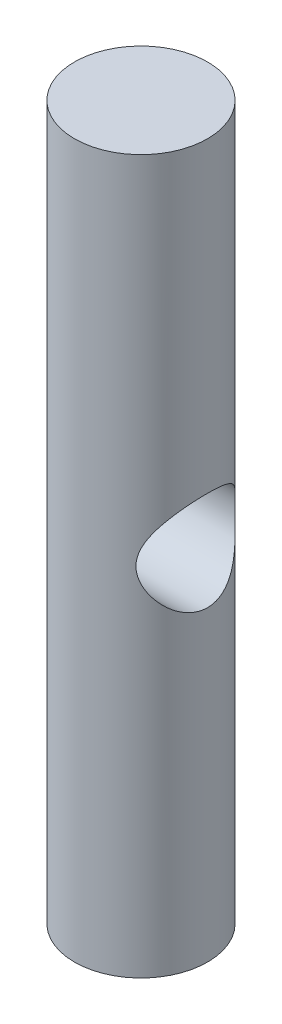
ISO-10303-21;
HEADER;
FILE_DESCRIPTION(('STEP AP214'),'2;1');
FILE_NAME('part.step','',(''),(''),'','','');
FILE_SCHEMA(('AUTOMOTIVE_DESIGN { 1 0 10303 214 1 1 1 1 }'));
ENDSEC;
DATA;
#1=APPLICATION_CONTEXT('core data for automotive mechanical design processes');
#2=APPLICATION_PROTOCOL_DEFINITION('international standard','automotive_design',2000,#1);
#3=PRODUCT_CONTEXT('',#1,'mechanical');
#4=PRODUCT('Part','Part','',(#3));
#5=PRODUCT_RELATED_PRODUCT_CATEGORY('part','',(#4));
#6=PRODUCT_DEFINITION_FORMATION('','',#4);
#7=PRODUCT_DEFINITION_CONTEXT('part definition',#1,'design');
#8=PRODUCT_DEFINITION('design','',#6,#7);
#9=PRODUCT_DEFINITION_SHAPE('','',#8);
#10=(LENGTH_UNIT() NAMED_UNIT(*) SI_UNIT(.MILLI.,.METRE.));
#11=(NAMED_UNIT(*) PLANE_ANGLE_UNIT() SI_UNIT($,.RADIAN.));
#12=(NAMED_UNIT(*) SI_UNIT($,.STERADIAN.) SOLID_ANGLE_UNIT());
#13=UNCERTAINTY_MEASURE_WITH_UNIT(LENGTH_MEASURE(1.E-05),#10,'distance_accuracy_value','');
#14=(GEOMETRIC_REPRESENTATION_CONTEXT(3) GLOBAL_UNCERTAINTY_ASSIGNED_CONTEXT((#13)) GLOBAL_UNIT_ASSIGNED_CONTEXT((#10,
#11,#12)) REPRESENTATION_CONTEXT('',''));
#15=CARTESIAN_POINT('',(0.,0.,0.));
#16=DIRECTION('',(0.,0.,1.));
#17=DIRECTION('',(1.,0.,0.));
#18=AXIS2_PLACEMENT_3D('',#15,#16,#17);
#19=CARTESIAN_POINT('',(0.,114.3,0.));
#20=DIRECTION('',(0.,-1.,0.));
#21=DIRECTION('',(0.,0.,-1.));
#22=AXIS2_PLACEMENT_3D('',#19,#20,#21);
#23=CYLINDRICAL_SURFACE('',#22,10.668);
#24=CARTESIAN_POINT('',(0.,114.3,0.));
#25=DIRECTION('',(0.,1.,0.));
#26=DIRECTION('',(0.,0.,1.));
#27=AXIS2_PLACEMENT_3D('',#24,#25,#26);
#28=CIRCLE('',#27,10.668);
#29=CARTESIAN_POINT('',(0.,114.3,10.668));
#30=VERTEX_POINT('',#29);
#31=EDGE_CURVE('E44',#30,#30,#28,.T.);
#32=ORIENTED_EDGE('',*,*,#31,.F.);
#33=EDGE_LOOP('',(#32));
#34=FACE_BOUND('',#33,.T.);
#35=CARTESIAN_POINT('',(0.,0.,0.));
#36=DIRECTION('',(0.,1.,0.));
#37=DIRECTION('',(0.,0.,1.));
#38=AXIS2_PLACEMENT_3D('',#35,#36,#37);
#39=CIRCLE('',#38,10.668);
#40=CARTESIAN_POINT('',(0.,0.,10.668));
#41=VERTEX_POINT('',#40);
#42=EDGE_CURVE('E48',#41,#41,#39,.T.);
#43=ORIENTED_EDGE('',*,*,#42,.T.);
#44=EDGE_LOOP('',(#43));
#45=FACE_BOUND('',#44,.T.);
#46=CARTESIAN_POINT('',(-7.12757446471098,57.15,7.9375));
#47=CARTESIAN_POINT('',(-7.1275782582537,57.3359229778828,7.93749812667577));
#48=CARTESIAN_POINT('',(-7.13488986877126,57.5218711362104,7.93094964996542));
#49=CARTESIAN_POINT('',(-7.16369207763003,57.8917601746274,7.90494155688109));
#50=CARTESIAN_POINT('',(-7.18518589704412,58.0757005890669,7.88547900744854));
#51=CARTESIAN_POINT('',(-7.24116104114432,58.4401999528348,7.83410781843201));
#52=CARTESIAN_POINT('',(-7.27566986599805,58.6207508863387,7.80217281996456));
#53=CARTESIAN_POINT('',(-7.35592943855328,58.9768887573134,7.72654888571563));
#54=CARTESIAN_POINT('',(-7.40168680699676,59.1524727031674,7.68285302620677));
#55=CARTESIAN_POINT('',(-7.50176542882527,59.4953569026921,7.5851530269348));
#56=CARTESIAN_POINT('',(-7.55595825834014,59.6627385630799,7.53130125329707));
#57=CARTESIAN_POINT('',(-7.6714886611951,59.9913130508089,7.41358938914481));
#58=CARTESIAN_POINT('',(-7.73282547014431,60.1525065378222,7.34973036913263));
#59=CARTESIAN_POINT('',(-7.92494223652926,60.6264946614711,7.14398604234518));
#60=CARTESIAN_POINT('',(-8.06390828927737,60.9299529311208,6.98785903000738));
#61=CARTESIAN_POINT('',(-8.29464257967159,61.3952016750473,6.70997107408412));
#62=CARTESIAN_POINT('',(-8.38323542779287,61.5653898068718,6.59918889448773));
#63=CARTESIAN_POINT('',(-8.56212621773988,61.8962699935625,6.36536334224975));
#64=CARTESIAN_POINT('',(-8.65242429737494,62.0569612765638,6.24231897516516));
#65=CARTESIAN_POINT('',(-8.83298177780522,62.368756210067,5.98410611473624));
#66=CARTESIAN_POINT('',(-8.92324094119569,62.5198459083775,5.84892063713774));
#67=CARTESIAN_POINT('',(-9.10191861623573,62.8117952238675,5.56679304751283));
#68=CARTESIAN_POINT('',(-9.19033712268011,62.9526548121202,5.41985090224539));
#69=CARTESIAN_POINT('',(-9.38108343652115,63.2506567629418,5.08388466129722));
#70=CARTESIAN_POINT('',(-9.48266148606145,63.4054308611042,4.89231788060584));
#71=CARTESIAN_POINT('',(-9.67825149608903,63.6981356460406,4.49300628499863));
#72=CARTESIAN_POINT('',(-9.77226179308477,63.8360626330263,4.28525793279973));
#73=CARTESIAN_POINT('',(-9.94991032769562,64.093126712137,3.85481719167538));
#74=CARTESIAN_POINT('',(-10.0335676991382,64.2122985809096,3.63215357942448));
#75=CARTESIAN_POINT('',(-10.1881170624292,64.4301999320132,3.17287114378755));
#76=CARTESIAN_POINT('',(-10.2590156503425,64.5289399812122,2.93625961571114));
#77=CARTESIAN_POINT('',(-10.3667817722848,64.6779236483152,2.52331126259019));
#78=CARTESIAN_POINT('',(-10.4074964766713,64.733853201444,2.35000501762191));
#79=CARTESIAN_POINT('',(-10.4806971445979,64.8340006673105,1.99835826673937));
#80=CARTESIAN_POINT('',(-10.5131850512656,64.8782213457375,1.82001896068982));
#81=CARTESIAN_POINT('',(-10.5692677409737,64.9543426643857,1.45947494688419));
#82=CARTESIAN_POINT('',(-10.5928684097485,64.9862514587217,1.27727288207752));
#83=CARTESIAN_POINT('',(-10.6307088783953,65.0373283469661,0.910114393632699));
#84=CARTESIAN_POINT('',(-10.6449483447914,65.0564959869942,0.72515787211198));
#85=CARTESIAN_POINT('',(-10.6637735725797,65.0818233289524,0.353390440480364));
#86=CARTESIAN_POINT('',(-10.6683347573192,65.0879499150611,0.166576016841276));
#87=CARTESIAN_POINT('',(-10.6676269488478,65.0869986179901,-0.206999685368297));
#88=CARTESIAN_POINT('',(-10.66235799421,65.0799207866243,-0.393760964144444));
#89=CARTESIAN_POINT('',(-10.6421074651865,65.0526714681407,-0.765828403781017));
#90=CARTESIAN_POINT('',(-10.6271239200418,65.0324973242269,-0.951134261664382));
#91=CARTESIAN_POINT('',(-10.5877742877013,64.9793655495664,-1.31888556977497));
#92=CARTESIAN_POINT('',(-10.5634082537452,64.9464079913576,-1.50133103622698));
#93=CARTESIAN_POINT('',(-10.5067678168636,64.8694886794467,-1.85614012265513));
#94=CARTESIAN_POINT('',(-10.4747824097391,64.8259280115467,-2.0286374503548));
#95=CARTESIAN_POINT('',(-10.4031139715916,64.7278350097179,-2.36890034919164));
#96=CARTESIAN_POINT('',(-10.3634282584372,64.6732988526155,-2.53666424821572));
#97=CARTESIAN_POINT('',(-10.2770673151524,64.5538839534095,-2.86656057430781));
#98=CARTESIAN_POINT('',(-10.2303938753026,64.4890078601605,-3.0286944307433));
#99=CARTESIAN_POINT('',(-10.1308037952371,64.3495305660412,-3.34676833303144));
#100=CARTESIAN_POINT('',(-10.0778848894646,64.2749258350492,-3.50270610365181));
#101=CARTESIAN_POINT('',(-9.89885357053805,64.020273909889,-3.99353316138266));
#102=CARTESIAN_POINT('',(-9.76198872776336,63.8223261763539,-4.31544189118964));
#103=CARTESIAN_POINT('',(-9.47022904502293,63.3877059551807,-4.92288566128622));
#104=CARTESIAN_POINT('',(-9.31531831999176,63.1509992741252,-5.20838818455684));
#105=CARTESIAN_POINT('',(-9.06084671753789,62.7455774735581,-5.63398123218334));
#106=CARTESIAN_POINT('',(-8.96408121440284,62.5878033860767,-5.78637465636788));
#107=CARTESIAN_POINT('',(-8.76941310499436,62.2605400755959,-6.07735474115923));
#108=CARTESIAN_POINT('',(-8.67151028062199,62.0910485736851,-6.21593870310568));
#109=CARTESIAN_POINT('',(-8.47678159714113,61.7407216361715,-6.47898081948535));
#110=CARTESIAN_POINT('',(-8.37995624889562,61.5598810686461,-6.60343251095274));
#111=CARTESIAN_POINT('',(-8.18994417645714,61.1871497171803,-6.83767220221024));
#112=CARTESIAN_POINT('',(-8.09675660531819,60.9952615314019,-6.947463629781));
#113=CARTESIAN_POINT('',(-7.93521637584351,60.6406891362071,-7.13094168710131));
#114=CARTESIAN_POINT('',(-7.86566602038518,60.4799976035953,-7.20743083090191));
#115=CARTESIAN_POINT('',(-7.73240189511267,60.1517045127545,-7.35021916181395));
#116=CARTESIAN_POINT('',(-7.66868992281944,59.9841008492957,-7.41651521490735));
#117=CARTESIAN_POINT('',(-7.54915521675386,59.6425810260774,-7.53815246154933));
#118=CARTESIAN_POINT('',(-7.49331847866348,59.4686767809803,-7.59351317319753));
#119=CARTESIAN_POINT('',(-7.39150632645507,59.1148659736846,-7.69265333501143));
#120=CARTESIAN_POINT('',(-7.34552399439146,58.9349637253805,-7.73644091476577));
#121=CARTESIAN_POINT('',(-7.27300695567511,58.6043723431128,-7.80458722834563));
#122=CARTESIAN_POINT('',(-7.24444059368037,58.4545622031606,-7.83105192241838));
#123=CARTESIAN_POINT('',(-7.19616182400082,58.1523247012667,-7.87544029658461));
#124=CARTESIAN_POINT('',(-7.17644507232662,57.9998986616201,-7.89336816739418));
#125=CARTESIAN_POINT('',(-7.14663666944401,57.6934425049234,-7.92036717289629));
#126=CARTESIAN_POINT('',(-7.13653733707373,57.5394137674745,-7.92944537570678));
#127=CARTESIAN_POINT('',(-7.12636300314775,57.2307511992389,-7.93859073163939));
#128=CARTESIAN_POINT('',(-7.12628813996628,57.076117360129,-7.93865776037444));
#129=CARTESIAN_POINT('',(-7.13616593901056,56.7674559157183,-7.9297794545977));
#130=CARTESIAN_POINT('',(-7.14611722939669,56.6134282303743,-7.92083535304385));
#131=CARTESIAN_POINT('',(-7.17562362809098,56.3070826695881,-7.89411437254757));
#132=CARTESIAN_POINT('',(-7.19517874220004,56.1547647951788,-7.87633748826997));
#133=CARTESIAN_POINT('',(-7.24315175056213,55.8526130227948,-7.83224324236881));
#134=CARTESIAN_POINT('',(-7.27158009148023,55.7027822731,-7.80591581249202));
#135=CARTESIAN_POINT('',(-7.33630425167469,55.406447600482,-7.7451166619067));
#136=CARTESIAN_POINT('',(-7.37260462486719,55.2599456576741,-7.71064022601185));
#137=CARTESIAN_POINT('',(-7.46715973658341,54.9154734643972,-7.61928910798254));
#138=CARTESIAN_POINT('',(-7.5284984798226,54.719277459394,-7.55889297279966));
#139=CARTESIAN_POINT('',(-7.66116017537533,54.3351092203048,-7.42440325772166));
#140=CARTESIAN_POINT('',(-7.73248787236494,54.1471409503479,-7.35030316315773));
#141=CARTESIAN_POINT('',(-7.88252210912334,53.7795345017849,-7.18917273185692));
#142=CARTESIAN_POINT('',(-7.96123996961098,53.5999097547637,-7.10212243389379));
#143=CARTESIAN_POINT('',(-8.1235727602082,53.2494574166946,-6.91585514687778));
#144=CARTESIAN_POINT('',(-8.20718720205928,53.0786289517144,-6.81663936981996));
#145=CARTESIAN_POINT('',(-8.38017816891985,52.7401304032378,-6.60290710263043));
#146=CARTESIAN_POINT('',(-8.46965396018285,52.5727688319257,-6.48798298077541));
#147=CARTESIAN_POINT('',(-8.64968700291302,52.2476444678524,-6.24595046478891));
#148=CARTESIAN_POINT('',(-8.74024453382726,52.0898842224976,-6.11883885993621));
#149=CARTESIAN_POINT('',(-8.92058217007954,51.7844009876679,-5.8527982938847));
#150=CARTESIAN_POINT('',(-9.01036274466578,51.6366715080947,-5.71387710732743));
#151=CARTESIAN_POINT('',(-9.18756892287068,51.3515891926303,-5.42435340856398));
#152=CARTESIAN_POINT('',(-9.27499447496337,51.2142365836581,-5.27375064105358));
#153=CARTESIAN_POINT('',(-9.44688093484806,50.9490690951839,-4.95934669422801));
#154=CARTESIAN_POINT('',(-9.5312978662371,50.8213777698274,-4.79541697253722));
#155=CARTESIAN_POINT('',(-9.694516508258,50.5781312563373,-4.45622924016571));
#156=CARTESIAN_POINT('',(-9.77332025498803,50.4625716603198,-4.2809753815925));
#157=CARTESIAN_POINT('',(-9.92375222974581,50.2445848741638,-3.91964846985867));
#158=CARTESIAN_POINT('',(-9.99538358170287,50.1421519612237,-3.73358018321333));
#159=CARTESIAN_POINT('',(-10.1299608261651,49.9515038033585,-3.3512916203522));
#160=CARTESIAN_POINT('',(-10.1929082838991,49.8632859957483,-3.15507318244051));
#161=CARTESIAN_POINT('',(-10.2996297753881,49.7147941986097,-2.7847780490852));
#162=CARTESIAN_POINT('',(-10.3448631497839,49.6523080234143,-2.61200686709395));
#163=CARTESIAN_POINT('',(-10.4272479988626,49.5390411244773,-2.26080489141446));
#164=CARTESIAN_POINT('',(-10.4644009285194,49.4882582933203,-2.08237512325836));
#165=CARTESIAN_POINT('',(-10.5298761952552,49.3990715634759,-1.7209423861372));
#166=CARTESIAN_POINT('',(-10.5582027496869,49.3606617525068,-1.53794164652936));
#167=CARTESIAN_POINT('',(-10.6054481365886,49.2967410259276,-1.16849090645068));
#168=CARTESIAN_POINT('',(-10.6243668643769,49.2712302538462,-0.982040867623104));
#169=CARTESIAN_POINT('',(-10.6524184657055,49.2334437606771,-0.606449728486161));
#170=CARTESIAN_POINT('',(-10.6615192448485,49.2212114454133,-0.417301838105684));
#171=CARTESIAN_POINT('',(-10.6696137347413,49.2103304318534,-0.0383974125605153));
#172=CARTESIAN_POINT('',(-10.6686074244922,49.2116817617794,0.151359123867909));
#173=CARTESIAN_POINT('',(-10.6565109552143,49.2279461459171,0.529979335670552));
#174=CARTESIAN_POINT('',(-10.6454199581571,49.2428603271894,0.718842935531446));
#175=CARTESIAN_POINT('',(-10.6134089340056,49.2860098823917,1.09419047115691));
#176=CARTESIAN_POINT('',(-10.5924891029516,49.3142449906299,1.28067445430777));
#177=CARTESIAN_POINT('',(-10.5425685686413,49.3818646825699,1.64068121799323));
#178=CARTESIAN_POINT('',(-10.5140237106545,49.4206218886477,1.81438612664616));
#179=CARTESIAN_POINT('',(-10.4490211722657,49.5092779242117,2.15747052282866));
#180=CARTESIAN_POINT('',(-10.4125607604111,49.5591805998823,2.32684849463807));
#181=CARTESIAN_POINT('',(-10.3323922756506,49.669528630267,2.6603169866993));
#182=CARTESIAN_POINT('',(-10.2886860414315,49.72997131057,2.82440883576369));
#183=CARTESIAN_POINT('',(-10.1947454315283,49.8607903033299,3.14668244852302));
#184=CARTESIAN_POINT('',(-10.144508670398,49.931170246446,3.30486202528802));
#185=CARTESIAN_POINT('',(-9.9751156607113,50.1704465352299,3.79888571478592));
#186=CARTESIAN_POINT('',(-9.84497220382925,50.3570666854795,4.12259746480257));
#187=CARTESIAN_POINT('',(-9.56544562643748,50.7689039592381,4.73520000552121));
#188=CARTESIAN_POINT('',(-9.41604845705692,50.9941493064948,5.02406506866043));
#189=CARTESIAN_POINT('',(-9.16930633926255,51.3805872582763,5.45569010654244));
#190=CARTESIAN_POINT('',(-9.07531868967735,51.5308894247055,5.61032610091552));
#191=CARTESIAN_POINT('',(-8.88546608792364,51.8429713287578,5.90640547393019));
#192=CARTESIAN_POINT('',(-8.78960081507892,52.0047530395489,6.04784657484156));
#193=CARTESIAN_POINT('',(-8.59797830858319,52.339412650973,6.31730559731534));
#194=CARTESIAN_POINT('',(-8.5022212058243,52.5122986065759,6.4453135931656));
#195=CARTESIAN_POINT('',(-8.31313650751589,52.8687897994798,6.68741807175107));
#196=CARTESIAN_POINT('',(-8.219808507008,53.0523932332925,6.8015168851371));
#197=CARTESIAN_POINT('',(-8.05175716562677,53.401894674793,6.99926150517912));
#198=CARTESIAN_POINT('',(-7.97634039790561,53.5663278099981,7.08490908208812));
#199=CARTESIAN_POINT('',(-7.83094353108315,53.9027898013477,7.24529227004736));
#200=CARTESIAN_POINT('',(-7.76096355147276,54.0748188243061,7.32002764129854));
#201=CARTESIAN_POINT('',(-7.6286450824059,54.4259757989742,7.4578220706947));
#202=CARTESIAN_POINT('',(-7.56629344983978,54.6050908165282,7.52090131007732));
#203=CARTESIAN_POINT('',(-7.45142128483218,54.9702414826254,7.63472933150161));
#204=CARTESIAN_POINT('',(-7.39889663363939,55.1562741924102,7.68548328207208));
#205=CARTESIAN_POINT('',(-7.31683750977387,55.4905952960373,7.76353883054468));
#206=CARTESIAN_POINT('',(-7.2847960853275,55.6376385901537,7.79354961348992));
#207=CARTESIAN_POINT('',(-7.22897928837055,55.9346509027691,7.84535125603428));
#208=CARTESIAN_POINT('',(-7.20519928479504,56.0846182321968,7.86714672143851));
#209=CARTESIAN_POINT('',(-7.16677666106757,56.3866057781371,7.90216535622655));
#210=CARTESIAN_POINT('',(-7.15212696804909,56.5386243121623,7.91539516137548));
#211=CARTESIAN_POINT('',(-7.13252550271825,56.8437563898509,7.93306217120785));
#212=CARTESIAN_POINT('',(-7.12757134026388,56.9968696542977,7.93750154291197));
#213=CARTESIAN_POINT('',(-7.12757446471098,57.15,7.9375));
#214=B_SPLINE_CURVE_WITH_KNOTS('',3,(#46,#47,#48,#49,#50,#51,#52,#53,#54,#55,#56,#57,#58,#59,
#60,#61,#62,#63,#64,#65,#66,#67,#68,#69,#70,#71,#72,#73,#74,#75,#76,#77,#78,#79,#80,#81,#82,#83,
#84,#85,#86,#87,#88,#89,#90,#91,#92,#93,#94,#95,#96,#97,#98,#99,#100,#101,#102,#103,#104,#105,
#106,#107,#108,#109,#110,#111,#112,#113,#114,#115,#116,#117,#118,#119,#120,#121,#122,#123,#124,
#125,#126,#127,#128,#129,#130,#131,#132,#133,#134,#135,#136,#137,#138,#139,#140,#141,#142,#143,
#144,#145,#146,#147,#148,#149,#150,#151,#152,#153,#154,#155,#156,#157,#158,#159,#160,#161,#162,
#163,#164,#165,#166,#167,#168,#169,#170,#171,#172,#173,#174,#175,#176,#177,#178,#179,#180,#181,
#182,#183,#184,#185,#186,#187,#188,#189,#190,#191,#192,#193,#194,#195,#196,#197,#198,#199,#200,
#201,#202,#203,#204,#205,#206,#207,#208,#209,#210,#211,#212,#213),.UNSPECIFIED.,.T.,.F.,(4,2,2,
2,2,2,2,2,2,2,2,2,2,2,2,2,2,2,2,2,2,2,2,2,2,2,2,2,2,2,2,2,2,2,2,2,2,2,2,2,2,2,2,2,2,2,2,2,2,2,2,
2,2,2,2,2,2,2,2,2,2,2,2,2,2,2,2,2,2,2,2,2,2,2,2,2,2,2,2,2,2,2,2,4),(0.,0.557560877962129,
1.11524843313626,1.67412102147412,2.2333233456377,2.78472177559473,3.33606126117694,
4.43791272340499,5.10214387208105,5.76642893270244,6.4316581865138,7.09688932127333,
7.89500773078861,8.69330110087617,9.4900963386462,10.2864784565494,10.8457322371076,
11.4048538013056,11.9636044231498,12.5223749483998,13.0825627040661,13.6427482615768,
14.2030474971929,14.7633435535118,15.3050624430333,15.8469703611545,16.3887396773707,
16.9307061292201,18.1317234883105,19.3338061591795,20.052446339368,20.7712266827248,
21.4903344258415,22.2092737356982,22.7820683591486,23.3550387461869,23.9269770298664,
24.4985124791551,24.9624122450629,25.4260840477732,25.8893852175199,26.352692782512,
26.815936963538,27.2791814243728,27.7429733445252,28.2070342842368,28.8488029373131,
29.490877466057,30.1339521333958,30.7769627859089,31.4419941798591,32.1072012563634,
32.7719737469064,33.4367607703341,34.108967155654,34.7809284532549,35.4525957939402,
36.1241419113014,36.6911945324594,37.2581449648017,37.8248240842413,38.3915095090312,
38.9600418394574,39.528575351094,40.0971561116701,40.6657255321388,41.2058943134586,
41.7462497901609,42.2864683565369,42.8268848093219,44.0091851802184,45.1923531779345,
45.897480162571,46.6027286433441,47.3084946159166,48.0141421658837,48.6141390303643,
49.2141490779757,49.8131103397428,50.4118199956346,50.8717677168128,51.3314571897054,
51.7907901164857,52.2500097942505),.UNSPECIFIED.);
#215=CARTESIAN_POINT('',(-7.12757446471098,57.15,7.9375));
#216=VERTEX_POINT('',#215);
#217=EDGE_CURVE('E40',#216,#216,#214,.T.);
#218=ORIENTED_EDGE('',*,*,#217,.F.);
#219=EDGE_LOOP('',(#218));
#220=FACE_BOUND('',#219,.T.);
#221=CARTESIAN_POINT('',(10.668,49.2125,0.));
#222=CARTESIAN_POINT('',(10.6679982235985,49.2125018462687,-0.194173463493706));
#223=CARTESIAN_POINT('',(10.6626851014942,49.2196387872934,-0.388414681727751));
#224=CARTESIAN_POINT('',(10.6415515291348,49.2480768730974,-0.775371224910892));
#225=CARTESIAN_POINT('',(10.6257240078167,49.2693875499001,-0.968085434609474));
#226=CARTESIAN_POINT('',(10.5838913816648,49.3258834180049,-1.35077445291409));
#227=CARTESIAN_POINT('',(10.5578645500405,49.3610982294121,-1.54074250986207));
#228=CARTESIAN_POINT('',(10.4962191805586,49.4448651521261,-1.91620039976705));
#229=CARTESIAN_POINT('',(10.4605963333546,49.4934232557912,-2.10168817985684));
#230=CARTESIAN_POINT('',(10.3808008556625,49.602808597386,-2.46570283470104));
#231=CARTESIAN_POINT('',(10.336686548424,49.6635522529885,-2.64426774285717));
#232=CARTESIAN_POINT('',(10.240611925396,49.7967731723931,-2.99485306886229));
#233=CARTESIAN_POINT('',(10.1886485076052,49.8692550760203,-3.16687086546524));
#234=CARTESIAN_POINT('',(10.0778833564138,50.0250848288914,-3.50340515922758));
#235=CARTESIAN_POINT('',(10.01908777757,50.1084229067293,-3.66792822462136));
#236=CARTESIAN_POINT('',(9.89558104965941,50.285292057408,-3.98915095153025));
#237=CARTESIAN_POINT('',(9.83086770215852,50.3788269208252,-4.14584767188158));
#238=CARTESIAN_POINT('',(9.69036305318783,50.5844109748858,-4.46499899079594));
#239=CARTESIAN_POINT('',(9.61410026399102,50.6973717256426,-4.62665842290061));
#240=CARTESIAN_POINT('',(9.45703840106685,50.9338059540829,-4.93977069249648));
#241=CARTESIAN_POINT('',(9.37623874634634,51.0572807792544,-5.09122221726879));
#242=CARTESIAN_POINT('',(9.21130812165831,51.3142814514785,-5.383891027631));
#243=CARTESIAN_POINT('',(9.12717209335581,51.4478228601154,-5.52509177700157));
#244=CARTESIAN_POINT('',(8.95709017199413,51.7242271632707,-5.79676117729455));
#245=CARTESIAN_POINT('',(8.8711447839807,51.8670874793709,-5.92723277443433));
#246=CARTESIAN_POINT('',(8.68158980611391,52.1913402174175,-6.20237246208449));
#247=CARTESIAN_POINT('',(8.57789069003572,52.3747185197463,-6.34464849557614));
#248=CARTESIAN_POINT('',(8.37262951663241,52.7540839424301,-6.61315844614557));
#249=CARTESIAN_POINT('',(8.27106810221062,52.9500747860256,-6.73938759313515));
#250=CARTESIAN_POINT('',(8.07335131372303,53.3542529392029,-6.9750154199336));
#251=CARTESIAN_POINT('',(7.97719032923984,53.5624271145797,-7.08443177947339));
#252=CARTESIAN_POINT('',(7.79393555594932,53.9907854564252,-7.28555375736104));
#253=CARTESIAN_POINT('',(7.70683664231888,54.2109627262919,-7.37726941126031));
#254=CARTESIAN_POINT('',(7.5202698978362,54.7355425851254,-7.56801368117813));
#255=CARTESIAN_POINT('',(7.42571680681088,55.0444112996008,-7.6600454311593));
#256=CARTESIAN_POINT('',(7.30994497374178,55.52007571867,-7.77005529021021));
#257=CARTESIAN_POINT('',(7.2757090001379,55.6805991437601,-7.80204239080579));
#258=CARTESIAN_POINT('',(7.21718935894717,56.0050497190109,-7.85620761274224));
#259=CARTESIAN_POINT('',(7.19290061196802,56.1689750869794,-7.87839074078422));
#260=CARTESIAN_POINT('',(7.15518038777917,56.5006386288609,-7.91266583613859));
#261=CARTESIAN_POINT('',(7.14184849607725,56.6683978326324,-7.9246652765527));
#262=CARTESIAN_POINT('',(7.12707107895046,57.0048687292168,-7.93795840926517));
#263=CARTESIAN_POINT('',(7.1256252775971,57.1735803998278,-7.93925235008534));
#264=CARTESIAN_POINT('',(7.13469634603869,57.5104792543478,-7.93110124360336));
#265=CARTESIAN_POINT('',(7.14521778639921,57.6786662132501,-7.92165209326755));
#266=CARTESIAN_POINT('',(7.17769992312988,58.0129877258701,-7.89223181657901));
#267=CARTESIAN_POINT('',(7.19966075842869,58.1791222546364,-7.87226056243786));
#268=CARTESIAN_POINT('',(7.2512211966267,58.4913181015111,-7.82477494312497));
#269=CARTESIAN_POINT('',(7.2798130282152,58.6376982678268,-7.79823788704293));
#270=CARTESIAN_POINT('',(7.3444387383459,58.9271859166978,-7.73740359552194));
#271=CARTESIAN_POINT('',(7.38047527852829,59.0702922083929,-7.70310358424274));
#272=CARTESIAN_POINT('',(7.498222999477,59.4940697906275,-7.58912297863979));
#273=CARTESIAN_POINT('',(7.58956882201684,59.7691803140741,-7.49836485472228));
#274=CARTESIAN_POINT('',(7.77036706404471,60.2510076497321,-7.31034980918725));
#275=CARTESIAN_POINT('',(7.85682437352277,60.4607241666125,-7.21767548537096));
#276=CARTESIAN_POINT('',(8.03735829777264,60.8689110838668,-7.0160820375471));
#277=CARTESIAN_POINT('',(8.13143871169807,61.0673757918486,-6.90715479047407));
#278=CARTESIAN_POINT('',(8.32414827492528,61.4531516990434,-6.67366083511032));
#279=CARTESIAN_POINT('',(8.42278635340385,61.6404392005441,-6.54906252499666));
#280=CARTESIAN_POINT('',(8.6216596543059,62.0032147264803,-6.284945278381));
#281=CARTESIAN_POINT('',(8.72189462992853,62.178704552781,-6.14542862883571));
#282=CARTESIAN_POINT('',(8.92386795890091,62.5214721871471,-5.84840211081006));
#283=CARTESIAN_POINT('',(9.02558717986399,62.6884647076705,-5.6905496726704));
#284=CARTESIAN_POINT('',(9.22580364267782,63.0090787098205,-5.359863398581));
#285=CARTESIAN_POINT('',(9.32430055880786,63.1626988423149,-5.18702805451741));
#286=CARTESIAN_POINT('',(9.51563637284307,63.455334793263,-4.82704566807624));
#287=CARTESIAN_POINT('',(9.60848469877308,63.5943752439252,-4.63992371846411));
#288=CARTESIAN_POINT('',(9.78648932442247,63.8568888155755,-4.2516384982739));
#289=CARTESIAN_POINT('',(9.87164765103681,63.9803660420633,-4.0504789525882));
#290=CARTESIAN_POINT('',(10.015662934679,64.1867223673338,-3.67751221652343));
#291=CARTESIAN_POINT('',(10.0763341235635,64.2727363830002,-3.50813393213919));
#292=CARTESIAN_POINT('',(10.1903706655665,64.4331669905766,-3.16161666269955));
#293=CARTESIAN_POINT('',(10.2437375240801,64.5075859726184,-2.98447928672784));
#294=CARTESIAN_POINT('',(10.3421262656486,64.6439633393139,-2.62329282408182));
#295=CARTESIAN_POINT('',(10.387151426905,64.7059266197479,-2.43924648690146));
#296=CARTESIAN_POINT('',(10.4679385452534,64.8166062426506,-2.06520889117995));
#297=CARTESIAN_POINT('',(10.5037003736617,64.8653224010943,-1.87521755009344));
#298=CARTESIAN_POINT('',(10.5653306638103,64.9490192832368,-1.48942632581983));
#299=CARTESIAN_POINT('',(10.5911388929907,64.9839164163522,-1.29359857328152));
#300=CARTESIAN_POINT('',(10.6319258605307,65.0389715668441,-0.898755975574261));
#301=CARTESIAN_POINT('',(10.6469045772435,65.0591295547589,-0.699741124035491));
#302=CARTESIAN_POINT('',(10.6656467237715,65.0843414017839,-0.300285406193024));
#303=CARTESIAN_POINT('',(10.6694133870917,65.0893996156013,-0.0998449677409975));
#304=CARTESIAN_POINT('',(10.6656409168943,65.0843293462369,0.300727637590647));
#305=CARTESIAN_POINT('',(10.6581026006116,65.0742019608196,0.500859825706725));
#306=CARTESIAN_POINT('',(10.6331836513277,65.0406518594523,0.87986142706334));
#307=CARTESIAN_POINT('',(10.6168208273942,65.0186035181007,1.05892235010453));
#308=CARTESIAN_POINT('',(10.575360745326,64.9625727391632,1.41420041090409));
#309=CARTESIAN_POINT('',(10.5502605669691,64.9285863115634,1.59041657725038));
#310=CARTESIAN_POINT('',(10.4918293117964,64.8491485183561,1.9387971507691));
#311=CARTESIAN_POINT('',(10.4585001681173,64.8036998453892,2.1109624991646));
#312=CARTESIAN_POINT('',(10.3842162566073,64.7018766632644,2.45040440671212));
#313=CARTESIAN_POINT('',(10.343258508165,64.645497883195,2.61767902532465));
#314=CARTESIAN_POINT('',(10.2526552992554,64.5199788245623,2.95307278936012));
#315=CARTESIAN_POINT('',(10.2027281575336,64.4504187416642,3.12095875880343));
#316=CARTESIAN_POINT('',(10.0962670090296,64.3008764862108,3.44986244278332));
#317=CARTESIAN_POINT('',(10.0397307522783,64.220890763339,3.61087779271267));
#318=CARTESIAN_POINT('',(9.86155746785102,63.9663614521104,4.08273022733038));
#319=CARTESIAN_POINT('',(9.73128514204561,63.777149207475,4.38262788872671));
#320=CARTESIAN_POINT('',(9.51280666176282,63.4507243228282,4.83185818911219));
#321=CARTESIAN_POINT('',(9.42960692290122,63.3245630107459,4.9919841414018));
#322=CARTESIAN_POINT('',(9.25943064234909,63.0614145712451,5.30096348788405));
#323=CARTESIAN_POINT('',(9.17245456036664,62.924428759877,5.44981824814026));
#324=CARTESIAN_POINT('',(8.99605059190257,62.6399091509131,5.7363480651617));
#325=CARTESIAN_POINT('',(8.90661715361319,62.4923500061994,5.87399444375212));
#326=CARTESIAN_POINT('',(8.72714906760183,62.1874592475614,6.13746611941888));
#327=CARTESIAN_POINT('',(8.63711457438268,62.0301300647964,6.26329433788047));
#328=CARTESIAN_POINT('',(8.44167257622824,61.6760557547541,6.52500806081899));
#329=CARTESIAN_POINT('',(8.33648931894272,61.4773894987857,6.6584745301233));
#330=CARTESIAN_POINT('',(8.13096300419054,61.0668639533248,6.90795130823711));
#331=CARTESIAN_POINT('',(8.03062173961389,60.85499984246,7.02395518420008));
#332=CARTESIAN_POINT('',(7.83898820545805,60.4188978495051,7.23719401080274));
#333=CARTESIAN_POINT('',(7.74767213727127,60.1946950765539,7.33447900047455));
#334=CARTESIAN_POINT('',(7.578456467941,59.7338879799378,7.50919567769317));
#335=CARTESIAN_POINT('',(7.50054525111758,59.4972946273538,7.58664458249364));
#336=CARTESIAN_POINT('',(7.3901215102349,59.1074576254228,7.69387643515624));
#337=CARTESIAN_POINT('',(7.35175709369805,58.9577151623547,7.73046639000611));
#338=CARTESIAN_POINT('',(7.28315528317866,58.6545935921807,7.7951329777386));
#339=CARTESIAN_POINT('',(7.25291504106498,58.5012157801114,7.82321259457513));
#340=CARTESIAN_POINT('',(7.20170016030377,58.1918219802923,7.87038467826715));
#341=CARTESIAN_POINT('',(7.18070942972983,58.0358110685795,7.88949275726755));
#342=CARTESIAN_POINT('',(7.14877678758979,57.7218940588845,7.9184394529045));
#343=CARTESIAN_POINT('',(7.13783496231958,57.5639879446389,7.92827798993801));
#344=CARTESIAN_POINT('',(7.12646421092528,57.2468547559609,7.93850067228854));
#345=CARTESIAN_POINT('',(7.12607737985207,57.0876249249264,7.93884696098501));
#346=CARTESIAN_POINT('',(7.1359410559813,56.7697704673445,7.92998179734401));
#347=CARTESIAN_POINT('',(7.14619139866277,56.6111458314748,7.92077049283007));
#348=CARTESIAN_POINT('',(7.17688475444333,56.295570448135,7.89296990924221));
#349=CARTESIAN_POINT('',(7.19733774855605,56.1386214938168,7.87437144672176));
#350=CARTESIAN_POINT('',(7.24759942803356,55.8275106764424,7.82813427612753));
#351=CARTESIAN_POINT('',(7.27741371945731,55.6733505421449,7.80049015059481));
#352=CARTESIAN_POINT('',(7.35374858346031,55.3307423412081,7.72864762588271));
#353=CARTESIAN_POINT('',(7.40258043443077,55.1433130692414,7.68204128054512));
#354=CARTESIAN_POINT('',(7.51074986767657,54.7751176079737,7.5763162752128));
#355=CARTESIAN_POINT('',(7.57009194171526,54.5943543075812,7.51719226341254));
#356=CARTESIAN_POINT('',(7.6970505099603,54.2397177953873,7.38714460102179));
#357=CARTESIAN_POINT('',(7.76468296096582,54.0658587513116,7.31619809787694));
#358=CARTESIAN_POINT('',(7.90598440422736,53.7256433676792,7.16327289846682));
#359=CARTESIAN_POINT('',(7.97965368059711,53.559287381814,7.08129368284744));
#360=CARTESIAN_POINT('',(8.15527910499138,53.1823460764376,6.87901369221273));
#361=CARTESIAN_POINT('',(8.2587698955562,52.9745543693762,6.75482481175776));
#362=CARTESIAN_POINT('',(8.46924837061298,52.5723133858764,6.48897754694807));
#363=CARTESIAN_POINT('',(8.57623703667646,52.3778679029234,6.34731422746038));
#364=CARTESIAN_POINT('',(8.79059278300851,52.0025803441256,6.04696340501947));
#365=CARTESIAN_POINT('',(8.8979600583427,51.8217468661402,5.88826529322956));
#366=CARTESIAN_POINT('',(9.11015876993224,51.4744777483915,5.55431100185828));
#367=CARTESIAN_POINT('',(9.21499049427475,51.308040467356,5.37905671458143));
#368=CARTESIAN_POINT('',(9.42005931374913,50.9896343119064,5.01131459782464));
#369=CARTESIAN_POINT('',(9.52026767557796,50.837750875257,4.81873650975164));
#370=CARTESIAN_POINT('',(9.71287501945871,50.5508391736839,4.41766528272783));
#371=CARTESIAN_POINT('',(9.80527300672437,50.4158130547896,4.2091701228796));
#372=CARTESIAN_POINT('',(9.979505787637,50.1645586358256,3.77753284581939));
#373=CARTESIAN_POINT('',(10.0613602458266,50.0482952362026,3.55441920170487));
#374=CARTESIAN_POINT('',(10.2121637360015,49.8362095021849,3.09457481566067));
#375=CARTESIAN_POINT('',(10.2811196232852,49.7403763057949,2.85785139498525));
#376=CARTESIAN_POINT('',(10.3856962249873,49.5960575137623,2.4443198813811));
#377=CARTESIAN_POINT('',(10.4251514076085,49.5419424107246,2.2704215587129));
#378=CARTESIAN_POINT('',(10.495749200895,49.4454872214776,1.91775390841326));
#379=CARTESIAN_POINT('',(10.5268938367368,49.4031442664376,1.73898577921668));
#380=CARTESIAN_POINT('',(10.5801813222711,49.3308880226948,1.37810812229033));
#381=CARTESIAN_POINT('',(10.6023463206375,49.3009441470283,1.19600798827396));
#382=CARTESIAN_POINT('',(10.6373062624126,49.2537844724681,0.829344867227839));
#383=CARTESIAN_POINT('',(10.6501065901259,49.2365613595986,0.644783357646816));
#384=CARTESIAN_POINT('',(10.6613905486436,49.2213849488525,0.383208579743165));
#385=CARTESIAN_POINT('',(10.663867646816,49.2180546033046,0.306633644852594));
#386=CARTESIAN_POINT('',(10.6671728135859,49.2136116428553,0.153376003891986));
#387=CARTESIAN_POINT('',(10.6680007016307,49.2124992707736,0.0766932869416855));
#388=CARTESIAN_POINT('',(10.668,49.2125,0.));
#389=B_SPLINE_CURVE_WITH_KNOTS('',3,(#221,#222,#223,#224,#225,#226,#227,#228,#229,#230,#231,
#232,#233,#234,#235,#236,#237,#238,#239,#240,#241,#242,#243,#244,#245,#246,#247,#248,#249,#250,
#251,#252,#253,#254,#255,#256,#257,#258,#259,#260,#261,#262,#263,#264,#265,#266,#267,#268,#269,
#270,#271,#272,#273,#274,#275,#276,#277,#278,#279,#280,#281,#282,#283,#284,#285,#286,#287,#288,
#289,#290,#291,#292,#293,#294,#295,#296,#297,#298,#299,#300,#301,#302,#303,#304,#305,#306,#307,
#308,#309,#310,#311,#312,#313,#314,#315,#316,#317,#318,#319,#320,#321,#322,#323,#324,#325,#326,
#327,#328,#329,#330,#331,#332,#333,#334,#335,#336,#337,#338,#339,#340,#341,#342,#343,#344,#345,
#346,#347,#348,#349,#350,#351,#352,#353,#354,#355,#356,#357,#358,#359,#360,#361,#362,#363,#364,
#365,#366,#367,#368,#369,#370,#371,#372,#373,#374,#375,#376,#377,#378,#379,#380,#381,#382,#383,
#384,#385,#386,#387,#388),.UNSPECIFIED.,.T.,.F.,(4,2,2,2,2,2,2,2,2,2,2,2,2,2,2,2,2,2,2,2,2,2,2,
2,2,2,2,2,2,2,2,2,2,2,2,2,2,2,2,2,2,2,2,2,2,2,2,2,2,2,2,2,2,2,2,2,2,2,2,2,2,2,2,2,2,2,2,2,2,2,2,
2,2,2,2,2,2,2,2,2,2,2,2,4),(0.,0.582436018606606,1.16526412967916,1.74934060241072,
2.33367980878534,2.91414016263382,3.49483051995196,4.07500177597262,4.65538944640145,
5.28913781092166,5.92296751947772,6.55779797121388,7.19245351277454,7.9542486021239,
8.71626961534292,9.4774837481552,10.2382650286876,11.2416853737741,11.7428450174178,
12.2437484318575,12.7491556613623,13.2545511581064,13.7601397418771,14.2657344660408,
14.7197528343092,15.1739338054999,16.0823552423897,16.816598900086,17.5512107630644,
18.2873285172226,19.0233335870918,19.7764280608582,20.529598426036,21.2814750900965,
22.0331529959371,22.6308444010609,23.2284124381448,23.8257451366574,24.4230861327147,
25.0239871524518,25.6248893733162,26.2256182799249,26.8263037620365,27.3691386604682,
27.9121551611177,28.4550442182726,28.9981458370617,29.562941941348,30.127930884594,
31.2570736556979,31.9171486657524,32.5771435465231,33.2387772631581,33.9002469946772,
34.6836010111229,35.4672428959818,36.2487599367966,37.0295963226467,37.5057389915698,
37.9817145183828,38.4568586608927,38.9320068837083,39.4090497999023,39.8860853379721,
40.3635884665837,40.8413780974456,41.4381194322656,42.0351164150649,42.633281055097,
43.2314738629973,44.0202407707996,44.8092309544699,45.5987153837716,46.3881096870887,
47.181885681487,47.9757626251227,48.7681367969699,49.5600886358433,50.118574294593,
50.6769237328287,51.233887467563,51.7905307186003,52.0205520738591,52.2505986100667),.UNSPECIFIED.);
#390=CARTESIAN_POINT('',(10.668,49.2125,0.));
#391=VERTEX_POINT('',#390);
#392=EDGE_CURVE('E10',#391,#391,#389,.T.);
#393=ORIENTED_EDGE('',*,*,#392,.F.);
#394=EDGE_LOOP('',(#393));
#395=FACE_BOUND('',#394,.T.);
#396=ADVANCED_FACE('F30',(#34,#45,#220,#395),#23,.T.);
#397=CARTESIAN_POINT('',(0.,114.3,0.));
#398=DIRECTION('',(0.,1.,0.));
#399=DIRECTION('',(0.,0.,1.));
#400=AXIS2_PLACEMENT_3D('',#397,#398,#399);
#401=PLANE('',#400);
#402=ORIENTED_EDGE('',*,*,#31,.T.);
#403=EDGE_LOOP('',(#402));
#404=FACE_BOUND('',#403,.T.);
#405=ADVANCED_FACE('F58',(#404),#401,.T.);
#406=CARTESIAN_POINT('',(0.,0.,0.));
#407=DIRECTION('',(0.,1.,0.));
#408=DIRECTION('',(0.,0.,1.));
#409=AXIS2_PLACEMENT_3D('',#406,#407,#408);
#410=PLANE('',#409);
#411=ORIENTED_EDGE('',*,*,#42,.F.);
#412=EDGE_LOOP('',(#411));
#413=FACE_BOUND('',#412,.T.);
#414=ADVANCED_FACE('F57',(#413),#410,.F.);
#415=CARTESIAN_POINT('',(10.668,57.15,0.));
#416=DIRECTION('',(-1.,0.,0.));
#417=DIRECTION('',(0.,0.,1.));
#418=AXIS2_PLACEMENT_3D('',#415,#416,#417);
#419=CYLINDRICAL_SURFACE('',#418,7.9375);
#420=ORIENTED_EDGE('',*,*,#217,.T.);
#421=EDGE_LOOP('',(#420));
#422=FACE_BOUND('',#421,.T.);
#423=ORIENTED_EDGE('',*,*,#392,.T.);
#424=EDGE_LOOP('',(#423));
#425=FACE_BOUND('',#424,.T.);
#426=ADVANCED_FACE('F53',(#422,#425),#419,.F.);
#427=CLOSED_SHELL('',(#396,#405,#414,#426));
#428=MANIFOLD_SOLID_BREP('B2',#427);
#429=ADVANCED_BREP_SHAPE_REPRESENTATION('',(#18,#428),#14);
#430=SHAPE_DEFINITION_REPRESENTATION(#9,#429);
ENDSEC;
END-ISO-10303-21;
